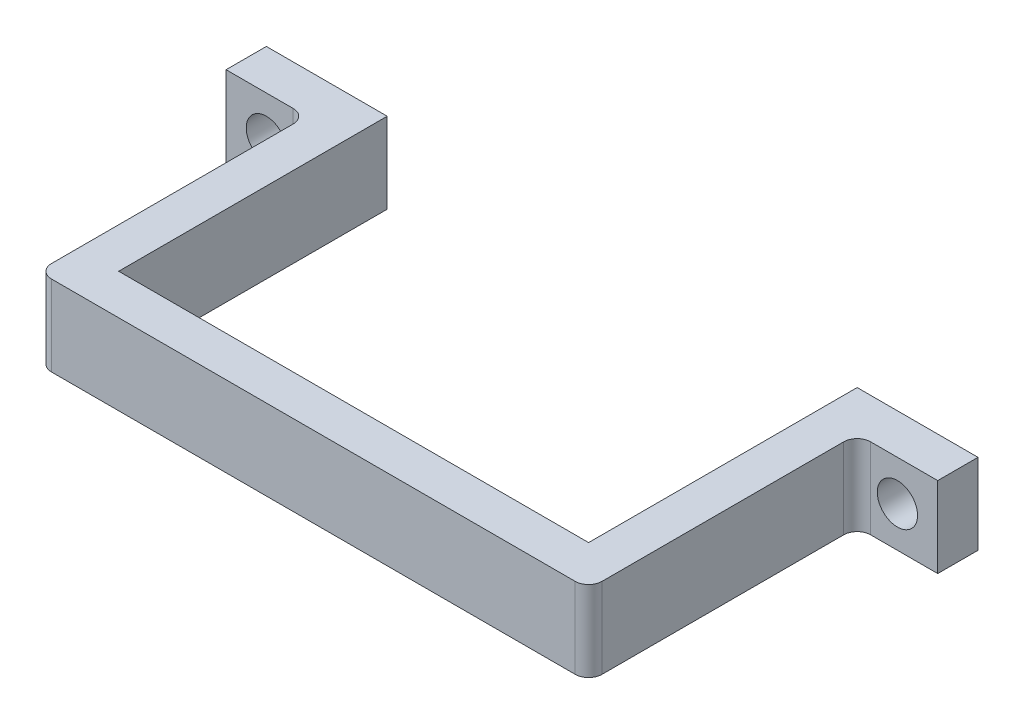
ISO-10303-21;
HEADER;
FILE_DESCRIPTION(('STEP AP214'),'2;1');
FILE_NAME('part.step','',(''),(''),'','','');
FILE_SCHEMA(('AUTOMOTIVE_DESIGN { 1 0 10303 214 1 1 1 1 }'));
ENDSEC;
DATA;
#1=APPLICATION_CONTEXT('core data for automotive mechanical design processes');
#2=APPLICATION_PROTOCOL_DEFINITION('international standard','automotive_design',2000,#1);
#3=PRODUCT_CONTEXT('',#1,'mechanical');
#4=PRODUCT('Part','Part','',(#3));
#5=PRODUCT_RELATED_PRODUCT_CATEGORY('part','',(#4));
#6=PRODUCT_DEFINITION_FORMATION('','',#4);
#7=PRODUCT_DEFINITION_CONTEXT('part definition',#1,'design');
#8=PRODUCT_DEFINITION('design','',#6,#7);
#9=PRODUCT_DEFINITION_SHAPE('','',#8);
#10=(LENGTH_UNIT() NAMED_UNIT(*) SI_UNIT(.MILLI.,.METRE.));
#11=(NAMED_UNIT(*) PLANE_ANGLE_UNIT() SI_UNIT($,.RADIAN.));
#12=(NAMED_UNIT(*) SI_UNIT($,.STERADIAN.) SOLID_ANGLE_UNIT());
#13=UNCERTAINTY_MEASURE_WITH_UNIT(LENGTH_MEASURE(1.E-05),#10,'distance_accuracy_value','');
#14=(GEOMETRIC_REPRESENTATION_CONTEXT(3) GLOBAL_UNCERTAINTY_ASSIGNED_CONTEXT((#13)) GLOBAL_UNIT_ASSIGNED_CONTEXT((#10,
#11,#12)) REPRESENTATION_CONTEXT('',''));
#15=CARTESIAN_POINT('',(0.,0.,0.));
#16=DIRECTION('',(0.,0.,1.));
#17=DIRECTION('',(1.,0.,0.));
#18=AXIS2_PLACEMENT_3D('',#15,#16,#17);
#19=CARTESIAN_POINT('',(0.,6.,-21.9789272030652));
#20=DIRECTION('',(0.,0.,1.));
#21=DIRECTION('',(1.,0.,0.));
#22=AXIS2_PLACEMENT_3D('',#19,#20,#21);
#23=PLANE('',#22);
#24=CARTESIAN_POINT('',(-22.8716475095785,3.,-21.9789272030651));
#25=DIRECTION('',(0.,0.,1.));
#26=DIRECTION('',(1.,0.,0.));
#27=AXIS2_PLACEMENT_3D('',#24,#25,#26);
#28=CIRCLE('',#27,1.5);
#29=CARTESIAN_POINT('',(-21.3716475095785,3.,-21.9789272030651));
#30=VERTEX_POINT('',#29);
#31=EDGE_CURVE('E186',#30,#30,#28,.T.);
#32=ORIENTED_EDGE('',*,*,#31,.T.);
#33=EDGE_LOOP('',(#32));
#34=FACE_BOUND('',#33,.T.);
#35=DIRECTION('',(-1.,0.,0.));
#36=VECTOR('',#35,1.);
#37=CARTESIAN_POINT('',(0.,0.,-21.9789272030652));
#38=LINE('',#37,#36);
#39=CARTESIAN_POINT('',(-16.8716475095785,0.,-21.9789272030651));
#40=VERTEX_POINT('',#39);
#41=CARTESIAN_POINT('',(-25.8716475095785,0.,-21.9789272030651));
#42=VERTEX_POINT('',#41);
#43=EDGE_CURVE('E174',#40,#42,#38,.T.);
#44=ORIENTED_EDGE('',*,*,#43,.T.);
#45=DIRECTION('',(0.,-1.,0.));
#46=VECTOR('',#45,1.);
#47=CARTESIAN_POINT('',(-25.8716475095785,6.,-21.9789272030651));
#48=LINE('',#47,#46);
#49=CARTESIAN_POINT('',(-25.8716475095785,6.,-21.9789272030651));
#50=VERTEX_POINT('',#49);
#51=EDGE_CURVE('E154',#50,#42,#48,.T.);
#52=ORIENTED_EDGE('',*,*,#51,.F.);
#53=DIRECTION('',(-1.,0.,0.));
#54=VECTOR('',#53,1.);
#55=CARTESIAN_POINT('',(0.,6.,-21.9789272030652));
#56=LINE('',#55,#54);
#57=CARTESIAN_POINT('',(-16.8716475095785,6.,-21.9789272030651));
#58=VERTEX_POINT('',#57);
#59=EDGE_CURVE('E161',#58,#50,#56,.T.);
#60=ORIENTED_EDGE('',*,*,#59,.F.);
#61=DIRECTION('',(0.,-1.,0.));
#62=VECTOR('',#61,1.);
#63=CARTESIAN_POINT('',(-16.8716475095785,6.,-21.9789272030651));
#64=LINE('',#63,#62);
#65=EDGE_CURVE('E252',#58,#40,#64,.T.);
#66=ORIENTED_EDGE('',*,*,#65,.T.);
#67=EDGE_LOOP('',(#44,#52,#60,#66));
#68=FACE_BOUND('',#67,.T.);
#69=ADVANCED_FACE('F37',(#34,#68),#23,.F.);
#70=CARTESIAN_POINT('',(-25.8716475095785,6.,0.));
#71=DIRECTION('',(1.,0.,0.));
#72=DIRECTION('',(0.,0.,-1.));
#73=AXIS2_PLACEMENT_3D('',#70,#71,#72);
#74=PLANE('',#73);
#75=DIRECTION('',(0.,0.,1.));
#76=VECTOR('',#75,1.);
#77=CARTESIAN_POINT('',(-25.8716475095785,0.,0.));
#78=LINE('',#77,#76);
#79=CARTESIAN_POINT('',(-25.8716475095785,0.,-18.9789272030651));
#80=VERTEX_POINT('',#79);
#81=EDGE_CURVE('E295',#42,#80,#78,.T.);
#82=ORIENTED_EDGE('',*,*,#81,.T.);
#83=DIRECTION('',(0.,-1.,0.));
#84=VECTOR('',#83,1.);
#85=CARTESIAN_POINT('',(-25.8716475095785,6.,-18.9789272030651));
#86=LINE('',#85,#84);
#87=CARTESIAN_POINT('',(-25.8716475095785,6.,-18.9789272030651));
#88=VERTEX_POINT('',#87);
#89=EDGE_CURVE('E157',#88,#80,#86,.T.);
#90=ORIENTED_EDGE('',*,*,#89,.F.);
#91=DIRECTION('',(0.,0.,1.));
#92=VECTOR('',#91,1.);
#93=CARTESIAN_POINT('',(-25.8716475095785,6.,0.));
#94=LINE('',#93,#92);
#95=EDGE_CURVE('E149',#50,#88,#94,.T.);
#96=ORIENTED_EDGE('',*,*,#95,.F.);
#97=ORIENTED_EDGE('',*,*,#51,.T.);
#98=EDGE_LOOP('',(#82,#90,#96,#97));
#99=FACE_BOUND('',#98,.T.);
#100=ADVANCED_FACE('F152',(#99),#74,.F.);
#101=CARTESIAN_POINT('',(0.,6.,-18.9789272030651));
#102=DIRECTION('',(0.,0.,1.));
#103=DIRECTION('',(1.,0.,0.));
#104=AXIS2_PLACEMENT_3D('',#101,#102,#103);
#105=PLANE('',#104);
#106=CARTESIAN_POINT('',(-22.8716475095785,3.,-18.9789272030651));
#107=DIRECTION('',(0.,0.,1.));
#108=DIRECTION('',(1.,0.,0.));
#109=AXIS2_PLACEMENT_3D('',#106,#107,#108);
#110=CIRCLE('',#109,1.5);
#111=CARTESIAN_POINT('',(-21.3716475095785,3.,-18.9789272030651));
#112=VERTEX_POINT('',#111);
#113=EDGE_CURVE('E187',#112,#112,#110,.T.);
#114=ORIENTED_EDGE('',*,*,#113,.F.);
#115=EDGE_LOOP('',(#114));
#116=FACE_BOUND('',#115,.T.);
#117=DIRECTION('',(-1.,0.,0.));
#118=VECTOR('',#117,1.);
#119=CARTESIAN_POINT('',(0.,0.,-18.9789272030651));
#120=LINE('',#119,#118);
#121=CARTESIAN_POINT('',(-20.8716475095785,0.,-18.9789272030651));
#122=VERTEX_POINT('',#121);
#123=EDGE_CURVE('E234',#122,#80,#120,.T.);
#124=ORIENTED_EDGE('',*,*,#123,.F.);
#125=DIRECTION('',(0.,-1.,0.));
#126=VECTOR('',#125,1.);
#127=CARTESIAN_POINT('',(-20.8716475095785,6.,-18.9789272030651));
#128=LINE('',#127,#126);
#129=CARTESIAN_POINT('',(-20.8716475095785,6.,-18.9789272030651));
#130=VERTEX_POINT('',#129);
#131=EDGE_CURVE('E178',#122,#130,#128,.F.);
#132=ORIENTED_EDGE('',*,*,#131,.T.);
#133=DIRECTION('',(-1.,0.,0.));
#134=VECTOR('',#133,1.);
#135=CARTESIAN_POINT('',(0.,6.,-18.9789272030651));
#136=LINE('',#135,#134);
#137=EDGE_CURVE('E160',#130,#88,#136,.T.);
#138=ORIENTED_EDGE('',*,*,#137,.T.);
#139=ORIENTED_EDGE('',*,*,#89,.T.);
#140=EDGE_LOOP('',(#124,#132,#138,#139));
#141=FACE_BOUND('',#140,.T.);
#142=ADVANCED_FACE('F300',(#116,#141),#105,.T.);
#143=CARTESIAN_POINT('',(-19.8716475095785,6.,0.));
#144=DIRECTION('',(-1.,0.,0.));
#145=DIRECTION('',(0.,0.,1.));
#146=AXIS2_PLACEMENT_3D('',#143,#144,#145);
#147=PLANE('',#146);
#148=DIRECTION('',(0.,0.,-1.));
#149=VECTOR('',#148,1.);
#150=CARTESIAN_POINT('',(-19.8716475095785,0.,0.));
#151=LINE('',#150,#149);
#152=CARTESIAN_POINT('',(-19.8716475095785,0.,0.0210727969348651));
#153=VERTEX_POINT('',#152);
#154=CARTESIAN_POINT('',(-19.8716475095785,0.,-17.9789272030651));
#155=VERTEX_POINT('',#154);
#156=EDGE_CURVE('E230',#153,#155,#151,.T.);
#157=ORIENTED_EDGE('',*,*,#156,.F.);
#158=DIRECTION('',(0.,-1.,0.));
#159=VECTOR('',#158,1.);
#160=CARTESIAN_POINT('',(-19.8716475095785,6.,0.0210727969348651));
#161=LINE('',#160,#159);
#162=CARTESIAN_POINT('',(-19.8716475095785,6.,0.0210727969348651));
#163=VERTEX_POINT('',#162);
#164=EDGE_CURVE('E45',#153,#163,#161,.F.);
#165=ORIENTED_EDGE('',*,*,#164,.T.);
#166=DIRECTION('',(0.,0.,-1.));
#167=VECTOR('',#166,1.);
#168=CARTESIAN_POINT('',(-19.8716475095785,6.,0.));
#169=LINE('',#168,#167);
#170=CARTESIAN_POINT('',(-19.8716475095785,6.,-17.9789272030651));
#171=VERTEX_POINT('',#170);
#172=EDGE_CURVE('E302',#163,#171,#169,.T.);
#173=ORIENTED_EDGE('',*,*,#172,.T.);
#174=DIRECTION('',(0.,-1.,0.));
#175=VECTOR('',#174,1.);
#176=CARTESIAN_POINT('',(-19.8716475095785,0.,-17.9789272030651));
#177=LINE('',#176,#175);
#178=EDGE_CURVE('E175',#171,#155,#177,.T.);
#179=ORIENTED_EDGE('',*,*,#178,.T.);
#180=EDGE_LOOP('',(#157,#165,#173,#179));
#181=FACE_BOUND('',#180,.T.);
#182=ADVANCED_FACE('F357',(#181),#147,.T.);
#183=CARTESIAN_POINT('',(0.,6.,1.02107279693487));
#184=DIRECTION('',(0.,0.,-1.));
#185=DIRECTION('',(-1.,0.,0.));
#186=AXIS2_PLACEMENT_3D('',#183,#184,#185);
#187=PLANE('',#186);
#188=DIRECTION('',(1.,0.,0.));
#189=VECTOR('',#188,1.);
#190=CARTESIAN_POINT('',(0.,6.,1.02107279693487));
#191=LINE('',#190,#189);
#192=CARTESIAN_POINT('',(-18.8716475095785,6.,1.02107279693487));
#193=VERTEX_POINT('',#192);
#194=CARTESIAN_POINT('',(20.1283524904215,6.,1.02107279693487));
#195=VERTEX_POINT('',#194);
#196=EDGE_CURVE('E223',#193,#195,#191,.T.);
#197=ORIENTED_EDGE('',*,*,#196,.F.);
#198=DIRECTION('',(0.,-1.,0.));
#199=VECTOR('',#198,1.);
#200=CARTESIAN_POINT('',(-18.8716475095785,0.,1.02107279693487));
#201=LINE('',#200,#199);
#202=CARTESIAN_POINT('',(-18.8716475095785,0.,1.02107279693487));
#203=VERTEX_POINT('',#202);
#204=EDGE_CURVE('E215',#193,#203,#201,.T.);
#205=ORIENTED_EDGE('',*,*,#204,.T.);
#206=DIRECTION('',(1.,0.,0.));
#207=VECTOR('',#206,1.);
#208=CARTESIAN_POINT('',(0.,0.,1.02107279693487));
#209=LINE('',#208,#207);
#210=CARTESIAN_POINT('',(20.1283524904215,0.,1.02107279693487));
#211=VERTEX_POINT('',#210);
#212=EDGE_CURVE('E222',#203,#211,#209,.T.);
#213=ORIENTED_EDGE('',*,*,#212,.T.);
#214=DIRECTION('',(0.,-1.,0.));
#215=VECTOR('',#214,1.);
#216=CARTESIAN_POINT('',(20.1283524904215,6.,1.02107279693487));
#217=LINE('',#216,#215);
#218=EDGE_CURVE('E210',#211,#195,#217,.F.);
#219=ORIENTED_EDGE('',*,*,#218,.T.);
#220=EDGE_LOOP('',(#197,#205,#213,#219));
#221=FACE_BOUND('',#220,.T.);
#222=ADVANCED_FACE('F221',(#221),#187,.F.);
#223=CARTESIAN_POINT('',(21.1283524904215,6.,0.));
#224=DIRECTION('',(1.,0.,0.));
#225=DIRECTION('',(0.,0.,-1.));
#226=AXIS2_PLACEMENT_3D('',#223,#224,#225);
#227=PLANE('',#226);
#228=DIRECTION('',(0.,0.,1.));
#229=VECTOR('',#228,1.);
#230=CARTESIAN_POINT('',(21.1283524904215,6.,0.));
#231=LINE('',#230,#229);
#232=CARTESIAN_POINT('',(21.1283524904215,6.,-17.9789272030651));
#233=VERTEX_POINT('',#232);
#234=CARTESIAN_POINT('',(21.1283524904215,6.,0.0210727969348651));
#235=VERTEX_POINT('',#234);
#236=EDGE_CURVE('E285',#233,#235,#231,.T.);
#237=ORIENTED_EDGE('',*,*,#236,.T.);
#238=DIRECTION('',(0.,-1.,0.));
#239=VECTOR('',#238,1.);
#240=CARTESIAN_POINT('',(21.1283524904215,0.,0.0210727969348651));
#241=LINE('',#240,#239);
#242=CARTESIAN_POINT('',(21.1283524904215,0.,0.0210727969348651));
#243=VERTEX_POINT('',#242);
#244=EDGE_CURVE('E204',#235,#243,#241,.T.);
#245=ORIENTED_EDGE('',*,*,#244,.T.);
#246=DIRECTION('',(0.,0.,1.));
#247=VECTOR('',#246,1.);
#248=CARTESIAN_POINT('',(21.1283524904215,0.,0.));
#249=LINE('',#248,#247);
#250=CARTESIAN_POINT('',(21.1283524904215,0.,-17.9789272030651));
#251=VERTEX_POINT('',#250);
#252=EDGE_CURVE('E229',#251,#243,#249,.T.);
#253=ORIENTED_EDGE('',*,*,#252,.F.);
#254=DIRECTION('',(0.,-1.,0.));
#255=VECTOR('',#254,1.);
#256=CARTESIAN_POINT('',(21.1283524904215,6.,-17.9789272030651));
#257=LINE('',#256,#255);
#258=EDGE_CURVE('E198',#251,#233,#257,.F.);
#259=ORIENTED_EDGE('',*,*,#258,.T.);
#260=EDGE_LOOP('',(#237,#245,#253,#259));
#261=FACE_BOUND('',#260,.T.);
#262=ADVANCED_FACE('F310',(#261),#227,.T.);
#263=CARTESIAN_POINT('',(0.,6.,-18.9789272030651));
#264=DIRECTION('',(0.,0.,-1.));
#265=DIRECTION('',(-1.,0.,0.));
#266=AXIS2_PLACEMENT_3D('',#263,#264,#265);
#267=PLANE('',#266);
#268=CARTESIAN_POINT('',(24.1283524904215,3.,-18.9789272030651));
#269=DIRECTION('',(0.,0.,1.));
#270=DIRECTION('',(1.,0.,0.));
#271=AXIS2_PLACEMENT_3D('',#268,#269,#270);
#272=CIRCLE('',#271,1.5);
#273=CARTESIAN_POINT('',(25.6283524904215,3.,-18.9789272030651));
#274=VERTEX_POINT('',#273);
#275=EDGE_CURVE('E366',#274,#274,#272,.T.);
#276=ORIENTED_EDGE('',*,*,#275,.F.);
#277=EDGE_LOOP('',(#276));
#278=FACE_BOUND('',#277,.T.);
#279=DIRECTION('',(1.,0.,0.));
#280=VECTOR('',#279,1.);
#281=CARTESIAN_POINT('',(0.,6.,-18.9789272030651));
#282=LINE('',#281,#280);
#283=CARTESIAN_POINT('',(22.1283524904215,6.,-18.9789272030651));
#284=VERTEX_POINT('',#283);
#285=CARTESIAN_POINT('',(27.1283524904215,6.,-18.9789272030651));
#286=VERTEX_POINT('',#285);
#287=EDGE_CURVE('E283',#284,#286,#282,.T.);
#288=ORIENTED_EDGE('',*,*,#287,.F.);
#289=DIRECTION('',(0.,-1.,0.));
#290=VECTOR('',#289,1.);
#291=CARTESIAN_POINT('',(22.1283524904215,6.,-18.9789272030651));
#292=LINE('',#291,#290);
#293=CARTESIAN_POINT('',(22.1283524904215,0.,-18.9789272030651));
#294=VERTEX_POINT('',#293);
#295=EDGE_CURVE('E195',#284,#294,#292,.T.);
#296=ORIENTED_EDGE('',*,*,#295,.T.);
#297=DIRECTION('',(1.,0.,0.));
#298=VECTOR('',#297,1.);
#299=CARTESIAN_POINT('',(0.,0.,-18.9789272030651));
#300=LINE('',#299,#298);
#301=CARTESIAN_POINT('',(27.1283524904215,0.,-18.9789272030651));
#302=VERTEX_POINT('',#301);
#303=EDGE_CURVE('E232',#294,#302,#300,.T.);
#304=ORIENTED_EDGE('',*,*,#303,.T.);
#305=DIRECTION('',(0.,-1.,0.));
#306=VECTOR('',#305,1.);
#307=CARTESIAN_POINT('',(27.1283524904215,6.,-18.9789272030651));
#308=LINE('',#307,#306);
#309=EDGE_CURVE('E180',#286,#302,#308,.T.);
#310=ORIENTED_EDGE('',*,*,#309,.F.);
#311=EDGE_LOOP('',(#288,#296,#304,#310));
#312=FACE_BOUND('',#311,.T.);
#313=ADVANCED_FACE('F342',(#278,#312),#267,.F.);
#314=CARTESIAN_POINT('',(27.1283524904215,6.,0.));
#315=DIRECTION('',(1.,0.,0.));
#316=DIRECTION('',(0.,0.,-1.));
#317=AXIS2_PLACEMENT_3D('',#314,#315,#316);
#318=PLANE('',#317);
#319=DIRECTION('',(0.,0.,1.));
#320=VECTOR('',#319,1.);
#321=CARTESIAN_POINT('',(27.1283524904215,0.,0.));
#322=LINE('',#321,#320);
#323=CARTESIAN_POINT('',(27.1283524904215,0.,-21.9789272030651));
#324=VERTEX_POINT('',#323);
#325=EDGE_CURVE('E239',#324,#302,#322,.T.);
#326=ORIENTED_EDGE('',*,*,#325,.F.);
#327=DIRECTION('',(0.,-1.,0.));
#328=VECTOR('',#327,1.);
#329=CARTESIAN_POINT('',(27.1283524904215,6.,-21.9789272030651));
#330=LINE('',#329,#328);
#331=CARTESIAN_POINT('',(27.1283524904215,6.,-21.9789272030651));
#332=VERTEX_POINT('',#331);
#333=EDGE_CURVE('E260',#332,#324,#330,.T.);
#334=ORIENTED_EDGE('',*,*,#333,.F.);
#335=DIRECTION('',(0.,0.,1.));
#336=VECTOR('',#335,1.);
#337=CARTESIAN_POINT('',(27.1283524904215,6.,0.));
#338=LINE('',#337,#336);
#339=EDGE_CURVE('E268',#332,#286,#338,.T.);
#340=ORIENTED_EDGE('',*,*,#339,.T.);
#341=ORIENTED_EDGE('',*,*,#309,.T.);
#342=EDGE_LOOP('',(#326,#334,#340,#341));
#343=FACE_BOUND('',#342,.T.);
#344=ADVANCED_FACE('F266',(#343),#318,.T.);
#345=CARTESIAN_POINT('',(0.,6.,-21.9789272030651));
#346=DIRECTION('',(0.,0.,1.));
#347=DIRECTION('',(1.,0.,0.));
#348=AXIS2_PLACEMENT_3D('',#345,#346,#347);
#349=PLANE('',#348);
#350=CARTESIAN_POINT('',(24.1283524904215,3.,-21.9789272030651));
#351=DIRECTION('',(0.,0.,1.));
#352=DIRECTION('',(1.,0.,0.));
#353=AXIS2_PLACEMENT_3D('',#350,#351,#352);
#354=CIRCLE('',#353,1.5);
#355=CARTESIAN_POINT('',(25.6283524904215,3.,-21.9789272030651));
#356=VERTEX_POINT('',#355);
#357=EDGE_CURVE('E184',#356,#356,#354,.T.);
#358=ORIENTED_EDGE('',*,*,#357,.T.);
#359=EDGE_LOOP('',(#358));
#360=FACE_BOUND('',#359,.T.);
#361=DIRECTION('',(-1.,0.,0.));
#362=VECTOR('',#361,1.);
#363=CARTESIAN_POINT('',(0.,0.,-21.9789272030651));
#364=LINE('',#363,#362);
#365=CARTESIAN_POINT('',(18.1283524904215,0.,-21.9789272030651));
#366=VERTEX_POINT('',#365);
#367=EDGE_CURVE('E242',#324,#366,#364,.T.);
#368=ORIENTED_EDGE('',*,*,#367,.T.);
#369=DIRECTION('',(0.,-1.,0.));
#370=VECTOR('',#369,1.);
#371=CARTESIAN_POINT('',(18.1283524904215,6.,-21.9789272030651));
#372=LINE('',#371,#370);
#373=CARTESIAN_POINT('',(18.1283524904215,6.,-21.9789272030651));
#374=VERTEX_POINT('',#373);
#375=EDGE_CURVE('E258',#374,#366,#372,.T.);
#376=ORIENTED_EDGE('',*,*,#375,.F.);
#377=DIRECTION('',(-1.,0.,0.));
#378=VECTOR('',#377,1.);
#379=CARTESIAN_POINT('',(0.,6.,-21.9789272030651));
#380=LINE('',#379,#378);
#381=EDGE_CURVE('E279',#332,#374,#380,.T.);
#382=ORIENTED_EDGE('',*,*,#381,.F.);
#383=ORIENTED_EDGE('',*,*,#333,.T.);
#384=EDGE_LOOP('',(#368,#376,#382,#383));
#385=FACE_BOUND('',#384,.T.);
#386=ADVANCED_FACE('F276',(#360,#385),#349,.F.);
#387=CARTESIAN_POINT('',(18.1283524904215,6.,0.));
#388=DIRECTION('',(-1.,0.,0.));
#389=DIRECTION('',(0.,0.,1.));
#390=AXIS2_PLACEMENT_3D('',#387,#388,#389);
#391=PLANE('',#390);
#392=DIRECTION('',(0.,0.,-1.));
#393=VECTOR('',#392,1.);
#394=CARTESIAN_POINT('',(18.1283524904215,0.,0.));
#395=LINE('',#394,#393);
#396=CARTESIAN_POINT('',(18.1283524904215,0.,-1.97892720306514));
#397=VERTEX_POINT('',#396);
#398=EDGE_CURVE('E245',#397,#366,#395,.T.);
#399=ORIENTED_EDGE('',*,*,#398,.F.);
#400=DIRECTION('',(0.,-1.,0.));
#401=VECTOR('',#400,1.);
#402=CARTESIAN_POINT('',(18.1283524904215,6.,-1.97892720306514));
#403=LINE('',#402,#401);
#404=CARTESIAN_POINT('',(18.1283524904215,6.,-1.97892720306514));
#405=VERTEX_POINT('',#404);
#406=EDGE_CURVE('E256',#405,#397,#403,.T.);
#407=ORIENTED_EDGE('',*,*,#406,.F.);
#408=DIRECTION('',(0.,0.,-1.));
#409=VECTOR('',#408,1.);
#410=CARTESIAN_POINT('',(18.1283524904215,6.,0.));
#411=LINE('',#410,#409);
#412=EDGE_CURVE('E281',#405,#374,#411,.T.);
#413=ORIENTED_EDGE('',*,*,#412,.T.);
#414=ORIENTED_EDGE('',*,*,#375,.T.);
#415=EDGE_LOOP('',(#399,#407,#413,#414));
#416=FACE_BOUND('',#415,.T.);
#417=ADVANCED_FACE('F393',(#416),#391,.T.);
#418=CARTESIAN_POINT('',(0.,6.,-1.97892720306514));
#419=DIRECTION('',(0.,0.,-1.));
#420=DIRECTION('',(-1.,0.,0.));
#421=AXIS2_PLACEMENT_3D('',#418,#419,#420);
#422=PLANE('',#421);
#423=DIRECTION('',(1.,0.,0.));
#424=VECTOR('',#423,1.);
#425=CARTESIAN_POINT('',(0.,0.,-1.97892720306514));
#426=LINE('',#425,#424);
#427=CARTESIAN_POINT('',(-16.8716475095785,0.,-1.97892720306514));
#428=VERTEX_POINT('',#427);
#429=EDGE_CURVE('E248',#428,#397,#426,.T.);
#430=ORIENTED_EDGE('',*,*,#429,.F.);
#431=DIRECTION('',(0.,-1.,0.));
#432=VECTOR('',#431,1.);
#433=CARTESIAN_POINT('',(-16.8716475095785,6.,-1.97892720306514));
#434=LINE('',#433,#432);
#435=CARTESIAN_POINT('',(-16.8716475095785,6.,-1.97892720306514));
#436=VERTEX_POINT('',#435);
#437=EDGE_CURVE('E254',#436,#428,#434,.T.);
#438=ORIENTED_EDGE('',*,*,#437,.F.);
#439=DIRECTION('',(1.,0.,0.));
#440=VECTOR('',#439,1.);
#441=CARTESIAN_POINT('',(0.,6.,-1.97892720306514));
#442=LINE('',#441,#440);
#443=EDGE_CURVE('E290',#436,#405,#442,.T.);
#444=ORIENTED_EDGE('',*,*,#443,.T.);
#445=ORIENTED_EDGE('',*,*,#406,.T.);
#446=EDGE_LOOP('',(#430,#438,#444,#445));
#447=FACE_BOUND('',#446,.T.);
#448=ADVANCED_FACE('F389',(#447),#422,.T.);
#449=CARTESIAN_POINT('',(-16.8716475095785,6.,0.));
#450=DIRECTION('',(-1.,0.,0.));
#451=DIRECTION('',(0.,0.,1.));
#452=AXIS2_PLACEMENT_3D('',#449,#450,#451);
#453=PLANE('',#452);
#454=DIRECTION('',(0.,0.,-1.));
#455=VECTOR('',#454,1.);
#456=CARTESIAN_POINT('',(-16.8716475095785,0.,0.));
#457=LINE('',#456,#455);
#458=EDGE_CURVE('E171',#428,#40,#457,.T.);
#459=ORIENTED_EDGE('',*,*,#458,.T.);
#460=ORIENTED_EDGE('',*,*,#65,.F.);
#461=DIRECTION('',(0.,0.,-1.));
#462=VECTOR('',#461,1.);
#463=CARTESIAN_POINT('',(-16.8716475095785,6.,0.));
#464=LINE('',#463,#462);
#465=EDGE_CURVE('E167',#436,#58,#464,.T.);
#466=ORIENTED_EDGE('',*,*,#465,.F.);
#467=ORIENTED_EDGE('',*,*,#437,.T.);
#468=EDGE_LOOP('',(#459,#460,#466,#467));
#469=FACE_BOUND('',#468,.T.);
#470=ADVANCED_FACE('F384',(#469),#453,.F.);
#471=CARTESIAN_POINT('',(0.,6.,0.));
#472=DIRECTION('',(0.,1.,0.));
#473=DIRECTION('',(0.,0.,1.));
#474=AXIS2_PLACEMENT_3D('',#471,#472,#473);
#475=PLANE('',#474);
#476=ORIENTED_EDGE('',*,*,#172,.F.);
#477=CARTESIAN_POINT('',(-18.8716475095785,6.,0.0210727969348651));
#478=DIRECTION('',(0.,1.,0.));
#479=DIRECTION('',(0.,0.,1.));
#480=AXIS2_PLACEMENT_3D('',#477,#478,#479);
#481=CIRCLE('',#480,1.);
#482=EDGE_CURVE('E11',#163,#193,#481,.T.);
#483=ORIENTED_EDGE('',*,*,#482,.T.);
#484=ORIENTED_EDGE('',*,*,#196,.T.);
#485=CARTESIAN_POINT('',(20.1283524904215,6.,0.0210727969348651));
#486=DIRECTION('',(0.,1.,0.));
#487=DIRECTION('',(0.,0.,1.));
#488=AXIS2_PLACEMENT_3D('',#485,#486,#487);
#489=CIRCLE('',#488,1.);
#490=EDGE_CURVE('E213',#195,#235,#489,.T.);
#491=ORIENTED_EDGE('',*,*,#490,.T.);
#492=ORIENTED_EDGE('',*,*,#236,.F.);
#493=CARTESIAN_POINT('',(22.1283524904215,6.,-17.9789272030651));
#494=DIRECTION('',(0.,1.,0.));
#495=DIRECTION('',(0.,0.,1.));
#496=AXIS2_PLACEMENT_3D('',#493,#494,#495);
#497=CIRCLE('',#496,1.);
#498=EDGE_CURVE('E202',#233,#284,#497,.F.);
#499=ORIENTED_EDGE('',*,*,#498,.T.);
#500=ORIENTED_EDGE('',*,*,#287,.T.);
#501=ORIENTED_EDGE('',*,*,#339,.F.);
#502=ORIENTED_EDGE('',*,*,#381,.T.);
#503=ORIENTED_EDGE('',*,*,#412,.F.);
#504=ORIENTED_EDGE('',*,*,#443,.F.);
#505=ORIENTED_EDGE('',*,*,#465,.T.);
#506=ORIENTED_EDGE('',*,*,#59,.T.);
#507=ORIENTED_EDGE('',*,*,#95,.T.);
#508=ORIENTED_EDGE('',*,*,#137,.F.);
#509=CARTESIAN_POINT('',(-20.8716475095785,6.,-17.9789272030651));
#510=DIRECTION('',(0.,1.,0.));
#511=DIRECTION('',(0.,0.,1.));
#512=AXIS2_PLACEMENT_3D('',#509,#510,#511);
#513=CIRCLE('',#512,1.);
#514=EDGE_CURVE('E192',#130,#171,#513,.F.);
#515=ORIENTED_EDGE('',*,*,#514,.T.);
#516=EDGE_LOOP('',(#476,#483,#484,#491,#492,#499,#500,#501,#502,#503,#504,#505,#506,#507,#508,#515));
#517=FACE_BOUND('',#516,.T.);
#518=ADVANCED_FACE('F164',(#517),#475,.T.);
#519=CARTESIAN_POINT('',(0.,0.,0.));
#520=DIRECTION('',(0.,1.,0.));
#521=DIRECTION('',(0.,0.,1.));
#522=AXIS2_PLACEMENT_3D('',#519,#520,#521);
#523=PLANE('',#522);
#524=ORIENTED_EDGE('',*,*,#212,.F.);
#525=CARTESIAN_POINT('',(-18.8716475095785,0.,0.0210727969348651));
#526=DIRECTION('',(0.,1.,0.));
#527=DIRECTION('',(0.,0.,1.));
#528=AXIS2_PLACEMENT_3D('',#525,#526,#527);
#529=CIRCLE('',#528,1.);
#530=EDGE_CURVE('E59',#203,#153,#529,.F.);
#531=ORIENTED_EDGE('',*,*,#530,.T.);
#532=ORIENTED_EDGE('',*,*,#156,.T.);
#533=CARTESIAN_POINT('',(-20.8716475095785,0.,-17.9789272030651));
#534=DIRECTION('',(0.,1.,0.));
#535=DIRECTION('',(0.,0.,1.));
#536=AXIS2_PLACEMENT_3D('',#533,#534,#535);
#537=CIRCLE('',#536,1.);
#538=EDGE_CURVE('E190',#155,#122,#537,.T.);
#539=ORIENTED_EDGE('',*,*,#538,.T.);
#540=ORIENTED_EDGE('',*,*,#123,.T.);
#541=ORIENTED_EDGE('',*,*,#81,.F.);
#542=ORIENTED_EDGE('',*,*,#43,.F.);
#543=ORIENTED_EDGE('',*,*,#458,.F.);
#544=ORIENTED_EDGE('',*,*,#429,.T.);
#545=ORIENTED_EDGE('',*,*,#398,.T.);
#546=ORIENTED_EDGE('',*,*,#367,.F.);
#547=ORIENTED_EDGE('',*,*,#325,.T.);
#548=ORIENTED_EDGE('',*,*,#303,.F.);
#549=CARTESIAN_POINT('',(22.1283524904215,0.,-17.9789272030651));
#550=DIRECTION('',(0.,1.,0.));
#551=DIRECTION('',(0.,0.,1.));
#552=AXIS2_PLACEMENT_3D('',#549,#550,#551);
#553=CIRCLE('',#552,1.);
#554=EDGE_CURVE('E200',#294,#251,#553,.T.);
#555=ORIENTED_EDGE('',*,*,#554,.T.);
#556=ORIENTED_EDGE('',*,*,#252,.T.);
#557=CARTESIAN_POINT('',(20.1283524904215,0.,0.0210727969348651));
#558=DIRECTION('',(0.,1.,0.));
#559=DIRECTION('',(0.,0.,1.));
#560=AXIS2_PLACEMENT_3D('',#557,#558,#559);
#561=CIRCLE('',#560,1.);
#562=EDGE_CURVE('E207',#243,#211,#561,.F.);
#563=ORIENTED_EDGE('',*,*,#562,.T.);
#564=EDGE_LOOP('',(#524,#531,#532,#539,#540,#541,#542,#543,#544,#545,#546,#547,#548,#555,#556,#563));
#565=FACE_BOUND('',#564,.T.);
#566=ADVANCED_FACE('F226',(#565),#523,.F.);
#567=CARTESIAN_POINT('',(24.1283524904215,3.,-24.9789272030651));
#568=DIRECTION('',(0.,0.,1.));
#569=DIRECTION('',(1.,0.,0.));
#570=AXIS2_PLACEMENT_3D('',#567,#568,#569);
#571=CYLINDRICAL_SURFACE('',#570,1.5);
#572=ORIENTED_EDGE('',*,*,#275,.T.);
#573=EDGE_LOOP('',(#572));
#574=FACE_BOUND('',#573,.T.);
#575=ORIENTED_EDGE('',*,*,#357,.F.);
#576=EDGE_LOOP('',(#575));
#577=FACE_BOUND('',#576,.T.);
#578=ADVANCED_FACE('F374',(#574,#577),#571,.F.);
#579=CARTESIAN_POINT('',(-22.8716475095785,3.,-24.9789272030651));
#580=DIRECTION('',(0.,0.,1.));
#581=DIRECTION('',(1.,0.,0.));
#582=AXIS2_PLACEMENT_3D('',#579,#580,#581);
#583=CYLINDRICAL_SURFACE('',#582,1.5);
#584=ORIENTED_EDGE('',*,*,#113,.T.);
#585=EDGE_LOOP('',(#584));
#586=FACE_BOUND('',#585,.T.);
#587=ORIENTED_EDGE('',*,*,#31,.F.);
#588=EDGE_LOOP('',(#587));
#589=FACE_BOUND('',#588,.T.);
#590=ADVANCED_FACE('F335',(#586,#589),#583,.F.);
#591=CARTESIAN_POINT('',(-20.8716475095785,6.,-17.9789272030651));
#592=DIRECTION('',(0.,1.,0.));
#593=DIRECTION('',(0.,0.,1.));
#594=AXIS2_PLACEMENT_3D('',#591,#592,#593);
#595=CYLINDRICAL_SURFACE('',#594,1.);
#596=ORIENTED_EDGE('',*,*,#514,.F.);
#597=ORIENTED_EDGE('',*,*,#131,.F.);
#598=ORIENTED_EDGE('',*,*,#538,.F.);
#599=ORIENTED_EDGE('',*,*,#178,.F.);
#600=EDGE_LOOP('',(#596,#597,#598,#599));
#601=FACE_BOUND('',#600,.T.);
#602=ADVANCED_FACE('F332',(#601),#595,.F.);
#603=CARTESIAN_POINT('',(22.1283524904215,6.,-17.9789272030651));
#604=DIRECTION('',(0.,-1.,0.));
#605=DIRECTION('',(0.,0.,-1.));
#606=AXIS2_PLACEMENT_3D('',#603,#604,#605);
#607=CYLINDRICAL_SURFACE('',#606,1.);
#608=ORIENTED_EDGE('',*,*,#498,.F.);
#609=ORIENTED_EDGE('',*,*,#258,.F.);
#610=ORIENTED_EDGE('',*,*,#554,.F.);
#611=ORIENTED_EDGE('',*,*,#295,.F.);
#612=EDGE_LOOP('',(#608,#609,#610,#611));
#613=FACE_BOUND('',#612,.T.);
#614=ADVANCED_FACE('F321',(#613),#607,.F.);
#615=CARTESIAN_POINT('',(20.1283524904215,6.,0.0210727969348651));
#616=DIRECTION('',(0.,1.,0.));
#617=DIRECTION('',(0.,0.,1.));
#618=AXIS2_PLACEMENT_3D('',#615,#616,#617);
#619=CYLINDRICAL_SURFACE('',#618,1.);
#620=ORIENTED_EDGE('',*,*,#490,.F.);
#621=ORIENTED_EDGE('',*,*,#218,.F.);
#622=ORIENTED_EDGE('',*,*,#562,.F.);
#623=ORIENTED_EDGE('',*,*,#244,.F.);
#624=EDGE_LOOP('',(#620,#621,#622,#623));
#625=FACE_BOUND('',#624,.T.);
#626=ADVANCED_FACE('F316',(#625),#619,.T.);
#627=CARTESIAN_POINT('',(-18.8716475095785,6.,0.0210727969348651));
#628=DIRECTION('',(0.,1.,0.));
#629=DIRECTION('',(0.,0.,1.));
#630=AXIS2_PLACEMENT_3D('',#627,#628,#629);
#631=CYLINDRICAL_SURFACE('',#630,1.);
#632=ORIENTED_EDGE('',*,*,#482,.F.);
#633=ORIENTED_EDGE('',*,*,#164,.F.);
#634=ORIENTED_EDGE('',*,*,#530,.F.);
#635=ORIENTED_EDGE('',*,*,#204,.F.);
#636=EDGE_LOOP('',(#632,#633,#634,#635));
#637=FACE_BOUND('',#636,.T.);
#638=ADVANCED_FACE('F39',(#637),#631,.T.);
#639=CLOSED_SHELL('',(#69,#100,#142,#182,#222,#262,#313,#344,#386,#417,#448,#470,#518,#566,#578,
#590,#602,#614,#626,#638));
#640=MANIFOLD_SOLID_BREP('B2',#639);
#641=ADVANCED_BREP_SHAPE_REPRESENTATION('',(#18,#640),#14);
#642=SHAPE_DEFINITION_REPRESENTATION(#9,#641);
ENDSEC;
END-ISO-10303-21;
